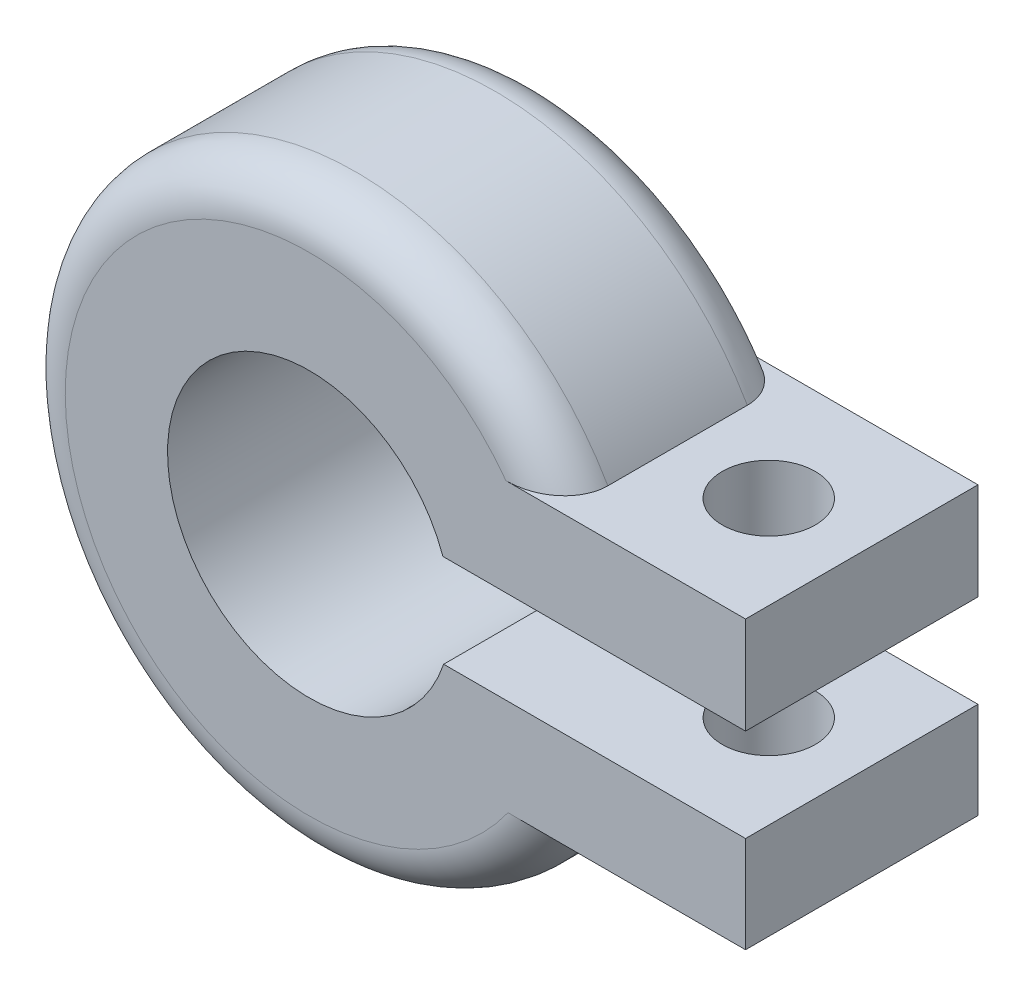
ISO-10303-21;
HEADER;
FILE_DESCRIPTION(('STEP AP214'),'2;1');
FILE_NAME('part.step','',(''),(''),'','','');
FILE_SCHEMA(('AUTOMOTIVE_DESIGN { 1 0 10303 214 1 1 1 1 }'));
ENDSEC;
DATA;
#1=APPLICATION_CONTEXT('core data for automotive mechanical design processes');
#2=APPLICATION_PROTOCOL_DEFINITION('international standard','automotive_design',2000,#1);
#3=PRODUCT_CONTEXT('',#1,'mechanical');
#4=PRODUCT('Part','Part','',(#3));
#5=PRODUCT_RELATED_PRODUCT_CATEGORY('part','',(#4));
#6=PRODUCT_DEFINITION_FORMATION('','',#4);
#7=PRODUCT_DEFINITION_CONTEXT('part definition',#1,'design');
#8=PRODUCT_DEFINITION('design','',#6,#7);
#9=PRODUCT_DEFINITION_SHAPE('','',#8);
#10=(LENGTH_UNIT() NAMED_UNIT(*) SI_UNIT(.MILLI.,.METRE.));
#11=(NAMED_UNIT(*) PLANE_ANGLE_UNIT() SI_UNIT($,.RADIAN.));
#12=(NAMED_UNIT(*) SI_UNIT($,.STERADIAN.) SOLID_ANGLE_UNIT());
#13=UNCERTAINTY_MEASURE_WITH_UNIT(LENGTH_MEASURE(1.E-05),#10,'distance_accuracy_value','');
#14=(GEOMETRIC_REPRESENTATION_CONTEXT(3) GLOBAL_UNCERTAINTY_ASSIGNED_CONTEXT((#13)) GLOBAL_UNIT_ASSIGNED_CONTEXT((#10,
#11,#12)) REPRESENTATION_CONTEXT('',''));
#15=CARTESIAN_POINT('',(0.,0.,0.));
#16=DIRECTION('',(0.,0.,1.));
#17=DIRECTION('',(1.,0.,0.));
#18=AXIS2_PLACEMENT_3D('',#15,#16,#17);
#19=CARTESIAN_POINT('',(0.,0.,5.));
#20=DIRECTION('',(0.,0.,-1.));
#21=DIRECTION('',(-1.,0.,0.));
#22=AXIS2_PLACEMENT_3D('',#19,#20,#21);
#23=CYLINDRICAL_SURFACE('',#22,3.05);
#24=CARTESIAN_POINT('',(0.,0.,0.));
#25=DIRECTION('',(0.,0.,-1.));
#26=DIRECTION('',(1.,0.,0.));
#27=AXIS2_PLACEMENT_3D('',#24,#25,#26);
#28=CIRCLE('',#27,3.05);
#29=CARTESIAN_POINT('',(2.88923663951569,-0.977144636622477,0.));
#30=VERTEX_POINT('',#29);
#31=CARTESIAN_POINT('',(2.87337204441225,1.02285536337752,0.));
#32=VERTEX_POINT('',#31);
#33=EDGE_CURVE('E151',#30,#32,#28,.T.);
#34=ORIENTED_EDGE('',*,*,#33,.T.);
#35=DIRECTION('',(0.,0.,-1.));
#36=VECTOR('',#35,1.);
#37=CARTESIAN_POINT('',(2.87337204441225,1.02285536337752,5.));
#38=LINE('',#37,#36);
#39=CARTESIAN_POINT('',(2.87337204441225,1.02285536337752,5.));
#40=VERTEX_POINT('',#39);
#41=EDGE_CURVE('E129',#40,#32,#38,.T.);
#42=ORIENTED_EDGE('',*,*,#41,.F.);
#43=CARTESIAN_POINT('',(0.,0.,5.));
#44=DIRECTION('',(0.,0.,-1.));
#45=DIRECTION('',(1.,0.,0.));
#46=AXIS2_PLACEMENT_3D('',#43,#44,#45);
#47=CIRCLE('',#46,3.05);
#48=CARTESIAN_POINT('',(2.88923663951569,-0.977144636622477,5.));
#49=VERTEX_POINT('',#48);
#50=EDGE_CURVE('E137',#49,#40,#47,.T.);
#51=ORIENTED_EDGE('',*,*,#50,.F.);
#52=DIRECTION('',(0.,0.,-1.));
#53=VECTOR('',#52,1.);
#54=CARTESIAN_POINT('',(2.88923663951569,-0.977144636622477,5.));
#55=LINE('',#54,#53);
#56=EDGE_CURVE('E251',#49,#30,#55,.T.);
#57=ORIENTED_EDGE('',*,*,#56,.T.);
#58=EDGE_LOOP('',(#34,#42,#51,#57));
#59=FACE_BOUND('',#58,.T.);
#60=ADVANCED_FACE('F45',(#59),#23,.F.);
#61=CARTESIAN_POINT('',(6.10433781249792,1.02285536337752,5.));
#62=DIRECTION('',(0.,1.,0.));
#63=DIRECTION('',(-1.,0.,0.));
#64=AXIS2_PLACEMENT_3D('',#61,#62,#63);
#65=PLANE('',#64);
#66=CARTESIAN_POINT('',(7.38171477533176,1.02285536337752,2.5));
#67=DIRECTION('',(0.,1.,0.));
#68=DIRECTION('',(-1.,0.,0.));
#69=AXIS2_PLACEMENT_3D('',#66,#67,#68);
#70=CIRCLE('',#69,1.);
#71=CARTESIAN_POINT('',(6.38171477533175,1.02285536337752,2.5));
#72=VERTEX_POINT('',#71);
#73=EDGE_CURVE('E255',#72,#72,#70,.T.);
#74=ORIENTED_EDGE('',*,*,#73,.T.);
#75=EDGE_LOOP('',(#74));
#76=FACE_BOUND('',#75,.T.);
#77=DIRECTION('',(1.,0.,0.));
#78=VECTOR('',#77,1.);
#79=CARTESIAN_POINT('',(6.10433781249792,1.02285536337752,0.));
#80=LINE('',#79,#78);
#81=CARTESIAN_POINT('',(9.38171477533175,1.02285536337752,0.));
#82=VERTEX_POINT('',#81);
#83=EDGE_CURVE('E254',#32,#82,#80,.T.);
#84=ORIENTED_EDGE('',*,*,#83,.T.);
#85=DIRECTION('',(0.,0.,-1.));
#86=VECTOR('',#85,1.);
#87=CARTESIAN_POINT('',(9.38171477533175,1.02285536337752,5.));
#88=LINE('',#87,#86);
#89=CARTESIAN_POINT('',(9.38171477533175,1.02285536337752,5.));
#90=VERTEX_POINT('',#89);
#91=EDGE_CURVE('E132',#90,#82,#88,.T.);
#92=ORIENTED_EDGE('',*,*,#91,.F.);
#93=DIRECTION('',(1.,0.,0.));
#94=VECTOR('',#93,1.);
#95=CARTESIAN_POINT('',(2.87337204441225,1.02285536337752,5.));
#96=LINE('',#95,#94);
#97=EDGE_CURVE('E125',#40,#90,#96,.T.);
#98=ORIENTED_EDGE('',*,*,#97,.F.);
#99=ORIENTED_EDGE('',*,*,#41,.T.);
#100=EDGE_LOOP('',(#84,#92,#98,#99));
#101=FACE_BOUND('',#100,.T.);
#102=ADVANCED_FACE('F127',(#76,#101),#65,.F.);
#103=CARTESIAN_POINT('',(9.38171477533175,1.02285536337752,5.));
#104=DIRECTION('',(-1.,0.,0.));
#105=DIRECTION('',(0.,0.,1.));
#106=AXIS2_PLACEMENT_3D('',#103,#104,#105);
#107=PLANE('',#106);
#108=DIRECTION('',(0.,1.,0.));
#109=VECTOR('',#108,1.);
#110=CARTESIAN_POINT('',(9.38171477533175,1.02285536337752,0.));
#111=LINE('',#110,#109);
#112=CARTESIAN_POINT('',(9.38171477533175,3.1115,0.));
#113=VERTEX_POINT('',#112);
#114=EDGE_CURVE('E258',#82,#113,#111,.T.);
#115=ORIENTED_EDGE('',*,*,#114,.T.);
#116=DIRECTION('',(0.,0.,-1.));
#117=VECTOR('',#116,1.);
#118=CARTESIAN_POINT('',(9.38171477533175,3.1115,5.));
#119=LINE('',#118,#117);
#120=CARTESIAN_POINT('',(9.38171477533175,3.1115,5.));
#121=VERTEX_POINT('',#120);
#122=EDGE_CURVE('E159',#121,#113,#119,.T.);
#123=ORIENTED_EDGE('',*,*,#122,.F.);
#124=DIRECTION('',(0.,1.,0.));
#125=VECTOR('',#124,1.);
#126=CARTESIAN_POINT('',(9.38171477533175,1.02285536337752,5.));
#127=LINE('',#126,#125);
#128=EDGE_CURVE('E136',#90,#121,#127,.T.);
#129=ORIENTED_EDGE('',*,*,#128,.F.);
#130=ORIENTED_EDGE('',*,*,#91,.T.);
#131=EDGE_LOOP('',(#115,#123,#129,#130));
#132=FACE_BOUND('',#131,.T.);
#133=ADVANCED_FACE('F195',(#132),#107,.F.);
#134=CARTESIAN_POINT('',(9.38171477533175,3.1115,5.));
#135=DIRECTION('',(0.,-1.,0.));
#136=DIRECTION('',(0.,0.,-1.));
#137=AXIS2_PLACEMENT_3D('',#134,#135,#136);
#138=PLANE('',#137);
#139=CARTESIAN_POINT('',(7.38171477533176,3.1115,2.5));
#140=DIRECTION('',(0.,-1.,0.));
#141=DIRECTION('',(0.,0.,-1.));
#142=AXIS2_PLACEMENT_3D('',#139,#140,#141);
#143=CIRCLE('',#142,1.);
#144=CARTESIAN_POINT('',(7.38171477533176,3.1115,1.5));
#145=VERTEX_POINT('',#144);
#146=EDGE_CURVE('E321',#145,#145,#143,.T.);
#147=ORIENTED_EDGE('',*,*,#146,.T.);
#148=EDGE_LOOP('',(#147));
#149=FACE_BOUND('',#148,.T.);
#150=DIRECTION('',(-1.,0.,0.));
#151=VECTOR('',#150,1.);
#152=CARTESIAN_POINT('',(9.38171477533175,3.1115,0.));
#153=LINE('',#152,#151);
#154=CARTESIAN_POINT('',(4.22860115759337,3.1115,0.));
#155=VERTEX_POINT('',#154);
#156=EDGE_CURVE('E70',#113,#155,#153,.T.);
#157=ORIENTED_EDGE('',*,*,#156,.T.);
#158=CARTESIAN_POINT('',(4.22860115759337,3.1115,0.));
#159=CARTESIAN_POINT('',(4.31327640058624,3.1115,-4.5602786065018E-05));
#160=CARTESIAN_POINT('',(4.39825517202309,3.1115,0.00698407794089241));
#161=CARTESIAN_POINT('',(4.56601909633386,3.1115,0.0360296983924466));
#162=CARTESIAN_POINT('',(4.6487908708212,3.1115,0.0581217908011693));
#163=CARTESIAN_POINT('',(4.78970788027471,3.1115,0.111111207594624));
#164=CARTESIAN_POINT('',(4.84907852118599,3.1115,0.138731724248678));
#165=CARTESIAN_POINT('',(4.96240923696194,3.1115,0.203313084322159));
#166=CARTESIAN_POINT('',(5.01638018603738,3.1115,0.240254605344044));
#167=CARTESIAN_POINT('',(5.11730217831266,3.1115,0.323563266134827));
#168=CARTESIAN_POINT('',(5.16419272069486,3.1115,0.37000443985936));
#169=CARTESIAN_POINT('',(5.2480123229729,3.1115,0.47123847878753));
#170=CARTESIAN_POINT('',(5.28494268623764,3.1115,0.526030249778837));
#171=CARTESIAN_POINT('',(5.3422878888876,3.1115,0.634219409585496));
#172=CARTESIAN_POINT('',(5.3642669366161,3.1115,0.686790577401717));
#173=CARTESIAN_POINT('',(5.39779764355505,3.1115,0.795095281986905));
#174=CARTESIAN_POINT('',(5.4093772875628,3.1115,0.85081990009933));
#175=CARTESIAN_POINT('',(5.41710194663595,3.1115,0.922485039708812));
#176=CARTESIAN_POINT('',(5.41835033616556,3.1115,0.937973304429526));
#177=CARTESIAN_POINT('',(5.42001330263519,3.1115,0.968971845121415));
#178=CARTESIAN_POINT('',(5.42042909638647,3.1115,0.984482055770714));
#179=CARTESIAN_POINT('',(5.42043058713975,3.1115,0.999999999999999));
#180=B_SPLINE_CURVE_WITH_KNOTS('',3,(#158,#159,#160,#161,#162,#163,#164,#165,#166,#167,#168,
#169,#170,#171,#172,#173,#174,#175,#176,#177,#178,#179),.UNSPECIFIED.,.F.,.F.,(4,2,2,2,2,2,2,2,
2,2,4),(0.,0.254231086058541,0.509757141623036,0.705400591192493,0.900641757888706,
1.09746681508067,1.29426610363306,1.46426533799012,1.63380572158576,1.68040670286269,
1.7269395284908),.UNSPECIFIED.);
#181=CARTESIAN_POINT('',(5.42043058713973,3.1115,1.));
#182=VERTEX_POINT('',#181);
#183=EDGE_CURVE('E11',#155,#182,#180,.T.);
#184=ORIENTED_EDGE('',*,*,#183,.T.);
#185=DIRECTION('',(0.,0.,-1.));
#186=VECTOR('',#185,1.);
#187=CARTESIAN_POINT('',(5.42043058713973,3.1115,5.));
#188=LINE('',#187,#186);
#189=CARTESIAN_POINT('',(5.42043058713973,3.1115,4.));
#190=VERTEX_POINT('',#189);
#191=EDGE_CURVE('E233',#190,#182,#188,.T.);
#192=ORIENTED_EDGE('',*,*,#191,.F.);
#193=CARTESIAN_POINT('',(5.42043058713973,3.1115,4.));
#194=CARTESIAN_POINT('',(5.42043198676956,3.1115,4.02532919661752));
#195=CARTESIAN_POINT('',(5.41932012115577,3.1115,4.05064531742106));
#196=CARTESIAN_POINT('',(5.4148952647237,3.1115,4.10107737402303));
#197=CARTESIAN_POINT('',(5.41158289811172,3.1115,4.12619336454747));
#198=CARTESIAN_POINT('',(5.39842408478147,3.1115,4.20076434785981));
#199=CARTESIAN_POINT('',(5.3853553616438,3.1115,4.24968667731043));
#200=CARTESIAN_POINT('',(5.3512293991694,3.1115,4.3445770975541));
#201=CARTESIAN_POINT('',(5.33017728221138,3.1115,4.39054706060175));
#202=CARTESIAN_POINT('',(5.28096546257148,3.1115,4.47853522280516));
#203=CARTESIAN_POINT('',(5.25280052339367,3.1115,4.52055047906575));
#204=CARTESIAN_POINT('',(5.18903001876911,3.1115,4.601562404731));
#205=CARTESIAN_POINT('',(5.1531487205075,3.1115,4.64034099987281));
#206=CARTESIAN_POINT('',(5.07604169624882,3.1115,4.71210944908204));
#207=CARTESIAN_POINT('',(5.03481585365475,3.1115,4.74509917682211));
#208=CARTESIAN_POINT('',(4.94286373935776,3.1115,4.80871524042185));
#209=CARTESIAN_POINT('',(4.89159259407713,3.1115,4.83855221286557));
#210=CARTESIAN_POINT('',(4.78522901036445,3.1115,4.89056229075081));
#211=CARTESIAN_POINT('',(4.73012965564723,3.1115,4.91272106803142));
#212=CARTESIAN_POINT('',(4.60199976735093,3.1115,4.954505661408));
#213=CARTESIAN_POINT('',(4.52820000581274,3.1115,4.9717651617356));
#214=CARTESIAN_POINT('',(4.37906846983946,3.1115,4.99450172228291));
#215=CARTESIAN_POINT('',(4.30374349271209,3.1115,5.00002280466268));
#216=CARTESIAN_POINT('',(4.22860115759337,3.1115,5.));
#217=B_SPLINE_CURVE_WITH_KNOTS('',3,(#193,#194,#195,#196,#197,#198,#199,#200,#201,#202,#203,
#204,#205,#206,#207,#208,#209,#210,#211,#212,#213,#214,#215,#216),.UNSPECIFIED.,.F.,.F.,(4,2,2,
2,2,2,2,2,2,2,2,4),(0.,0.075937671637138,0.151853811566356,0.302963070949507,0.453975537815457,
0.605099506588303,0.762960705476557,0.920825348857175,1.09810078354845,1.27570526979504,
1.5020784800153,1.72760122257288),.UNSPECIFIED.);
#218=CARTESIAN_POINT('',(4.22860115759337,3.1115,5.));
#219=VERTEX_POINT('',#218);
#220=EDGE_CURVE('E173',#190,#219,#217,.T.);
#221=ORIENTED_EDGE('',*,*,#220,.T.);
#222=DIRECTION('',(-1.,0.,0.));
#223=VECTOR('',#222,1.);
#224=CARTESIAN_POINT('',(9.38171477533175,3.1115,5.));
#225=LINE('',#224,#223);
#226=EDGE_CURVE('E232',#121,#219,#225,.T.);
#227=ORIENTED_EDGE('',*,*,#226,.F.);
#228=ORIENTED_EDGE('',*,*,#122,.T.);
#229=EDGE_LOOP('',(#157,#184,#192,#221,#227,#228));
#230=FACE_BOUND('',#229,.T.);
#231=ADVANCED_FACE('F198',(#149,#230),#138,.F.);
#232=CARTESIAN_POINT('',(0.,0.,5.));
#233=DIRECTION('',(0.,0.,-1.));
#234=DIRECTION('',(-1.,0.,0.));
#235=AXIS2_PLACEMENT_3D('',#232,#233,#234);
#236=CYLINDRICAL_SURFACE('',#235,6.25);
#237=ORIENTED_EDGE('',*,*,#191,.T.);
#238=CARTESIAN_POINT('',(0.,0.,1.));
#239=DIRECTION('',(0.,0.,1.));
#240=DIRECTION('',(1.,0.,0.));
#241=AXIS2_PLACEMENT_3D('',#238,#239,#240);
#242=CIRCLE('',#241,6.25);
#243=CARTESIAN_POINT('',(5.45527267879434,-3.05,1.));
#244=VERTEX_POINT('',#243);
#245=EDGE_CURVE('E218',#182,#244,#242,.T.);
#246=ORIENTED_EDGE('',*,*,#245,.T.);
#247=DIRECTION('',(0.,0.,-1.));
#248=VECTOR('',#247,1.);
#249=CARTESIAN_POINT('',(5.45527267879434,-3.05,5.));
#250=LINE('',#249,#248);
#251=CARTESIAN_POINT('',(5.45527267879434,-3.05,4.));
#252=VERTEX_POINT('',#251);
#253=EDGE_CURVE('E281',#252,#244,#250,.T.);
#254=ORIENTED_EDGE('',*,*,#253,.F.);
#255=CARTESIAN_POINT('',(0.,0.,4.));
#256=DIRECTION('',(0.,0.,1.));
#257=DIRECTION('',(1.,0.,0.));
#258=AXIS2_PLACEMENT_3D('',#255,#256,#257);
#259=CIRCLE('',#258,6.25);
#260=EDGE_CURVE('E157',#252,#190,#259,.F.);
#261=ORIENTED_EDGE('',*,*,#260,.T.);
#262=EDGE_LOOP('',(#237,#246,#254,#261));
#263=FACE_BOUND('',#262,.T.);
#264=ADVANCED_FACE('F202',(#263),#236,.T.);
#265=CARTESIAN_POINT('',(5.45527267879434,-3.05,5.));
#266=DIRECTION('',(0.,1.,0.));
#267=DIRECTION('',(-1.,0.,0.));
#268=AXIS2_PLACEMENT_3D('',#265,#266,#267);
#269=PLANE('',#268);
#270=CARTESIAN_POINT('',(7.38171477533176,-3.05,2.5));
#271=DIRECTION('',(0.,1.,0.));
#272=DIRECTION('',(-1.,0.,0.));
#273=AXIS2_PLACEMENT_3D('',#270,#271,#272);
#274=CIRCLE('',#273,1.);
#275=CARTESIAN_POINT('',(6.38171477533175,-3.05,2.5));
#276=VERTEX_POINT('',#275);
#277=EDGE_CURVE('E327',#276,#276,#274,.T.);
#278=ORIENTED_EDGE('',*,*,#277,.T.);
#279=EDGE_LOOP('',(#278));
#280=FACE_BOUND('',#279,.T.);
#281=DIRECTION('',(1.,0.,0.));
#282=VECTOR('',#281,1.);
#283=CARTESIAN_POINT('',(5.45527267879434,-3.05,0.));
#284=LINE('',#283,#282);
#285=CARTESIAN_POINT('',(4.2731721238443,-3.05,0.));
#286=VERTEX_POINT('',#285);
#287=CARTESIAN_POINT('',(9.38171477533175,-3.05,0.));
#288=VERTEX_POINT('',#287);
#289=EDGE_CURVE('E63',#286,#288,#284,.T.);
#290=ORIENTED_EDGE('',*,*,#289,.T.);
#291=DIRECTION('',(0.,0.,-1.));
#292=VECTOR('',#291,1.);
#293=CARTESIAN_POINT('',(9.38171477533175,-3.05,5.));
#294=LINE('',#293,#292);
#295=CARTESIAN_POINT('',(9.38171477533175,-3.05,5.));
#296=VERTEX_POINT('',#295);
#297=EDGE_CURVE('E277',#296,#288,#294,.T.);
#298=ORIENTED_EDGE('',*,*,#297,.F.);
#299=DIRECTION('',(1.,0.,0.));
#300=VECTOR('',#299,1.);
#301=CARTESIAN_POINT('',(5.45527267879434,-3.05,5.));
#302=LINE('',#301,#300);
#303=CARTESIAN_POINT('',(4.2731721238443,-3.05,5.));
#304=VERTEX_POINT('',#303);
#305=EDGE_CURVE('E236',#304,#296,#302,.T.);
#306=ORIENTED_EDGE('',*,*,#305,.F.);
#307=CARTESIAN_POINT('',(4.2731721238443,-3.05,5.));
#308=CARTESIAN_POINT('',(4.31562458654505,-3.05,4.999992754774));
#309=CARTESIAN_POINT('',(4.358055834016,-3.05,4.99820693274681));
#310=CARTESIAN_POINT('',(4.44265564296629,-3.05,4.99094152015534));
#311=CARTESIAN_POINT('',(4.48482377864078,-3.05,4.98545700652866));
#312=CARTESIAN_POINT('',(4.61069392816527,-3.05,4.96321050833014));
#313=CARTESIAN_POINT('',(4.69349196354587,-3.05,4.94065384981269));
#314=CARTESIAN_POINT('',(4.83364430672472,-3.05,4.88688520864498));
#315=CARTESIAN_POINT('',(4.892320641485,-3.05,4.85907051226816));
#316=CARTESIAN_POINT('',(5.00424082236717,-3.05,4.79419320319812));
#317=CARTESIAN_POINT('',(5.05749564234881,-3.05,4.75714981684767));
#318=CARTESIAN_POINT('',(5.15696099237476,-3.05,4.67380304571353));
#319=CARTESIAN_POINT('',(5.20311409080691,-3.05,4.62743051867169));
#320=CARTESIAN_POINT('',(5.28556023572178,-3.05,4.52652567500377));
#321=CARTESIAN_POINT('',(5.32185373840092,-3.05,4.47199373608894));
#322=CARTESIAN_POINT('',(5.37837132798263,-3.05,4.36414004074101));
#323=CARTESIAN_POINT('',(5.40007536008154,-3.05,4.3115909732845));
#324=CARTESIAN_POINT('',(5.43313920281671,-3.05,4.20339791144741));
#325=CARTESIAN_POINT('',(5.44452638536619,-3.05,4.14776252463927));
#326=CARTESIAN_POINT('',(5.45205826294486,-3.05,4.07641934863884));
#327=CARTESIAN_POINT('',(5.45326385078663,-3.05,4.06114891862543));
#328=CARTESIAN_POINT('',(5.45486975463643,-3.05,4.03058810622273));
#329=CARTESIAN_POINT('',(5.45527124402201,-3.05,4.01529778553452));
#330=CARTESIAN_POINT('',(5.45527267879435,-3.05,4.));
#331=B_SPLINE_CURVE_WITH_KNOTS('',3,(#307,#308,#309,#310,#311,#312,#313,#314,#315,#316,#317,
#318,#319,#320,#321,#322,#323,#324,#325,#326,#327,#328,#329,#330),.UNSPECIFIED.,.F.,.F.,(4,2,2,
2,2,2,2,2,2,2,2,4),(0.,0.12727103070923,0.254711797956166,0.510391480827815,0.704436127368586,
0.898079848144091,1.09321544059403,1.28834200272181,1.4579757192867,1.62715804675992,
1.67309831794539,1.71897150198143),.UNSPECIFIED.);
#332=EDGE_CURVE('E165',#304,#252,#331,.T.);
#333=ORIENTED_EDGE('',*,*,#332,.T.);
#334=ORIENTED_EDGE('',*,*,#253,.T.);
#335=CARTESIAN_POINT('',(5.45527267879434,-3.05,1.));
#336=CARTESIAN_POINT('',(5.45527401404607,-3.05,0.974554980718842));
#337=CARTESIAN_POINT('',(5.45415919673769,-3.05,0.949123046786662));
#338=CARTESIAN_POINT('',(5.44972212317211,-3.05,0.898459336566893));
#339=CARTESIAN_POINT('',(5.44640046969269,-3.05,0.873227507526296));
#340=CARTESIAN_POINT('',(5.43320254987981,-3.05,0.798304525892452));
#341=CARTESIAN_POINT('',(5.42009278722885,-3.05,0.749146809739411));
#342=CARTESIAN_POINT('',(5.38584648464414,-3.05,0.653792376306709));
#343=CARTESIAN_POINT('',(5.36471470284127,-3.05,0.607593922735819));
#344=CARTESIAN_POINT('',(5.31529762101521,-3.05,0.519172621312431));
#345=CARTESIAN_POINT('',(5.28700731893977,-3.05,0.476952581825202));
#346=CARTESIAN_POINT('',(5.22297625757749,-3.05,0.395623876833325));
#347=CARTESIAN_POINT('',(5.1869671585552,-3.05,0.356727440209824));
#348=CARTESIAN_POINT('',(5.10956397929131,-3.05,0.284771795575575));
#349=CARTESIAN_POINT('',(5.06816971317459,-3.05,0.251712789143206));
#350=CARTESIAN_POINT('',(4.97603888239681,-3.05,0.188173997216133));
#351=CARTESIAN_POINT('',(4.92477629052127,-3.05,0.158458635764041));
#352=CARTESIAN_POINT('',(4.8184310589146,-3.05,0.106739761960291));
#353=CARTESIAN_POINT('',(4.76334182949597,-3.05,0.0847499686235307));
#354=CARTESIAN_POINT('',(4.63700633451695,-3.05,0.0439976334606221));
#355=CARTESIAN_POINT('',(4.56508952166867,-3.05,0.0273212573108223));
#356=CARTESIAN_POINT('',(4.41978149185592,-3.05,0.00533126673123917));
#357=CARTESIAN_POINT('',(4.34639644417357,-3.05,-2.26384805166555E-05));
#358=CARTESIAN_POINT('',(4.2731721238443,-3.05,0.));
#359=B_SPLINE_CURVE_WITH_KNOTS('',3,(#335,#336,#337,#338,#339,#340,#341,#342,#343,#344,#345,
#346,#347,#348,#349,#350,#351,#352,#353,#354,#355,#356,#357,#358),.UNSPECIFIED.,.F.,.F.,(4,2,2,
2,2,2,2,2,2,2,2,4),(0.,0.0762850837541471,0.152549339473843,0.304370352321607,0.456101455335159,
0.607938875423905,0.766313745491003,0.924694083496554,1.10175967565685,1.27913812907286,
1.49966374231783,1.71940329001012),.UNSPECIFIED.);
#360=EDGE_CURVE('E56',#244,#286,#359,.T.);
#361=ORIENTED_EDGE('',*,*,#360,.T.);
#362=EDGE_LOOP('',(#290,#298,#306,#333,#334,#361));
#363=FACE_BOUND('',#362,.T.);
#364=ADVANCED_FACE('F180',(#280,#363),#269,.F.);
#365=CARTESIAN_POINT('',(9.38171477533175,-3.05,5.));
#366=DIRECTION('',(-1.,0.,0.));
#367=DIRECTION('',(0.,0.,1.));
#368=AXIS2_PLACEMENT_3D('',#365,#366,#367);
#369=PLANE('',#368);
#370=DIRECTION('',(0.,1.,0.));
#371=VECTOR('',#370,1.);
#372=CARTESIAN_POINT('',(9.38171477533175,-3.05,0.));
#373=LINE('',#372,#371);
#374=CARTESIAN_POINT('',(9.38171477533175,-0.977144636622476,0.));
#375=VERTEX_POINT('',#374);
#376=EDGE_CURVE('E265',#288,#375,#373,.T.);
#377=ORIENTED_EDGE('',*,*,#376,.T.);
#378=DIRECTION('',(0.,0.,-1.));
#379=VECTOR('',#378,1.);
#380=CARTESIAN_POINT('',(9.38171477533175,-0.977144636622476,5.));
#381=LINE('',#380,#379);
#382=CARTESIAN_POINT('',(9.38171477533175,-0.977144636622476,5.));
#383=VERTEX_POINT('',#382);
#384=EDGE_CURVE('E273',#383,#375,#381,.T.);
#385=ORIENTED_EDGE('',*,*,#384,.F.);
#386=DIRECTION('',(0.,1.,0.));
#387=VECTOR('',#386,1.);
#388=CARTESIAN_POINT('',(9.38171477533175,-3.05,5.));
#389=LINE('',#388,#387);
#390=EDGE_CURVE('E243',#296,#383,#389,.T.);
#391=ORIENTED_EDGE('',*,*,#390,.F.);
#392=ORIENTED_EDGE('',*,*,#297,.T.);
#393=EDGE_LOOP('',(#377,#385,#391,#392));
#394=FACE_BOUND('',#393,.T.);
#395=ADVANCED_FACE('F294',(#394),#369,.F.);
#396=CARTESIAN_POINT('',(2.88923663951569,-0.977144636622477,5.));
#397=DIRECTION('',(0.,-1.,0.));
#398=DIRECTION('',(1.,0.,0.));
#399=AXIS2_PLACEMENT_3D('',#396,#397,#398);
#400=PLANE('',#399);
#401=CARTESIAN_POINT('',(7.38171477533176,-0.977144636622476,2.5));
#402=DIRECTION('',(0.,-1.,0.));
#403=DIRECTION('',(1.,0.,0.));
#404=AXIS2_PLACEMENT_3D('',#401,#402,#403);
#405=CIRCLE('',#404,1.);
#406=CARTESIAN_POINT('',(8.38171477533176,-0.977144636622476,2.5));
#407=VERTEX_POINT('',#406);
#408=EDGE_CURVE('E50',#407,#407,#405,.T.);
#409=ORIENTED_EDGE('',*,*,#408,.T.);
#410=EDGE_LOOP('',(#409));
#411=FACE_BOUND('',#410,.T.);
#412=DIRECTION('',(-1.,0.,0.));
#413=VECTOR('',#412,1.);
#414=CARTESIAN_POINT('',(2.88923663951569,-0.977144636622477,0.));
#415=LINE('',#414,#413);
#416=EDGE_CURVE('E148',#375,#30,#415,.T.);
#417=ORIENTED_EDGE('',*,*,#416,.T.);
#418=ORIENTED_EDGE('',*,*,#56,.F.);
#419=DIRECTION('',(-1.,0.,0.));
#420=VECTOR('',#419,1.);
#421=CARTESIAN_POINT('',(6.11843340908958,-0.977144636622476,5.));
#422=LINE('',#421,#420);
#423=EDGE_CURVE('E143',#383,#49,#422,.T.);
#424=ORIENTED_EDGE('',*,*,#423,.F.);
#425=ORIENTED_EDGE('',*,*,#384,.T.);
#426=EDGE_LOOP('',(#417,#418,#424,#425));
#427=FACE_BOUND('',#426,.T.);
#428=ADVANCED_FACE('F296',(#411,#427),#400,.F.);
#429=CARTESIAN_POINT('',(0.,0.,5.));
#430=DIRECTION('',(0.,0.,1.));
#431=DIRECTION('',(1.,0.,0.));
#432=AXIS2_PLACEMENT_3D('',#429,#430,#431);
#433=PLANE('',#432);
#434=CARTESIAN_POINT('',(0.,0.,5.));
#435=DIRECTION('',(0.,0.,1.));
#436=DIRECTION('',(1.,0.,0.));
#437=AXIS2_PLACEMENT_3D('',#434,#435,#436);
#438=CIRCLE('',#437,5.25);
#439=EDGE_CURVE('E153',#219,#304,#438,.T.);
#440=ORIENTED_EDGE('',*,*,#439,.T.);
#441=ORIENTED_EDGE('',*,*,#305,.T.);
#442=ORIENTED_EDGE('',*,*,#390,.T.);
#443=ORIENTED_EDGE('',*,*,#423,.T.);
#444=ORIENTED_EDGE('',*,*,#50,.T.);
#445=ORIENTED_EDGE('',*,*,#97,.T.);
#446=ORIENTED_EDGE('',*,*,#128,.T.);
#447=ORIENTED_EDGE('',*,*,#226,.T.);
#448=EDGE_LOOP('',(#440,#441,#442,#443,#444,#445,#446,#447));
#449=FACE_BOUND('',#448,.T.);
#450=ADVANCED_FACE('F141',(#449),#433,.T.);
#451=CARTESIAN_POINT('',(0.,0.,0.));
#452=DIRECTION('',(0.,0.,1.));
#453=DIRECTION('',(1.,0.,0.));
#454=AXIS2_PLACEMENT_3D('',#451,#452,#453);
#455=PLANE('',#454);
#456=ORIENTED_EDGE('',*,*,#289,.F.);
#457=CARTESIAN_POINT('',(0.,0.,0.));
#458=DIRECTION('',(0.,0.,1.));
#459=DIRECTION('',(1.,0.,0.));
#460=AXIS2_PLACEMENT_3D('',#457,#458,#459);
#461=CIRCLE('',#460,5.25);
#462=EDGE_CURVE('E216',#286,#155,#461,.F.);
#463=ORIENTED_EDGE('',*,*,#462,.T.);
#464=ORIENTED_EDGE('',*,*,#156,.F.);
#465=ORIENTED_EDGE('',*,*,#114,.F.);
#466=ORIENTED_EDGE('',*,*,#83,.F.);
#467=ORIENTED_EDGE('',*,*,#33,.F.);
#468=ORIENTED_EDGE('',*,*,#416,.F.);
#469=ORIENTED_EDGE('',*,*,#376,.F.);
#470=EDGE_LOOP('',(#456,#463,#464,#465,#466,#467,#468,#469));
#471=FACE_BOUND('',#470,.T.);
#472=ADVANCED_FACE('F188',(#471),#455,.F.);
#473=CARTESIAN_POINT('',(0.,0.,4.));
#474=DIRECTION('',(0.,0.,1.));
#475=DIRECTION('',(1.,0.,0.));
#476=AXIS2_PLACEMENT_3D('',#473,#474,#475);
#477=TOROIDAL_SURFACE('',#476,5.25,1.);
#478=ORIENTED_EDGE('',*,*,#220,.F.);
#479=ORIENTED_EDGE('',*,*,#260,.F.);
#480=ORIENTED_EDGE('',*,*,#332,.F.);
#481=ORIENTED_EDGE('',*,*,#439,.F.);
#482=EDGE_LOOP('',(#478,#479,#480,#481));
#483=FACE_BOUND('',#482,.T.);
#484=ADVANCED_FACE('F184',(#483),#477,.T.);
#485=CARTESIAN_POINT('',(0.,0.,1.));
#486=DIRECTION('',(0.,0.,1.));
#487=DIRECTION('',(1.,0.,0.));
#488=AXIS2_PLACEMENT_3D('',#485,#486,#487);
#489=TOROIDAL_SURFACE('',#488,5.25,1.);
#490=ORIENTED_EDGE('',*,*,#183,.F.);
#491=ORIENTED_EDGE('',*,*,#462,.F.);
#492=ORIENTED_EDGE('',*,*,#360,.F.);
#493=ORIENTED_EDGE('',*,*,#245,.F.);
#494=EDGE_LOOP('',(#490,#491,#492,#493));
#495=FACE_BOUND('',#494,.T.);
#496=ADVANCED_FACE('F47',(#495),#489,.T.);
#497=CARTESIAN_POINT('',(7.38171477533176,-6.25,2.5));
#498=DIRECTION('',(0.,1.,0.));
#499=DIRECTION('',(0.,0.,1.));
#500=AXIS2_PLACEMENT_3D('',#497,#498,#499);
#501=CYLINDRICAL_SURFACE('',#500,1.);
#502=ORIENTED_EDGE('',*,*,#408,.F.);
#503=EDGE_LOOP('',(#502));
#504=FACE_BOUND('',#503,.T.);
#505=ORIENTED_EDGE('',*,*,#277,.F.);
#506=EDGE_LOOP('',(#505));
#507=FACE_BOUND('',#506,.T.);
#508=ADVANCED_FACE('F313',(#504,#507),#501,.F.);
#509=ORIENTED_EDGE('',*,*,#146,.F.);
#510=EDGE_LOOP('',(#509));
#511=FACE_BOUND('',#510,.T.);
#512=ORIENTED_EDGE('',*,*,#73,.F.);
#513=EDGE_LOOP('',(#512));
#514=FACE_BOUND('',#513,.T.);
#515=ADVANCED_FACE('F311',(#511,#514),#501,.F.);
#516=CLOSED_SHELL('',(#60,#102,#133,#231,#264,#364,#395,#428,#450,#472,#484,#496,#508,#515));
#517=MANIFOLD_SOLID_BREP('B2',#516);
#518=ADVANCED_BREP_SHAPE_REPRESENTATION('',(#18,#517),#14);
#519=SHAPE_DEFINITION_REPRESENTATION(#9,#518);
ENDSEC;
END-ISO-10303-21;
